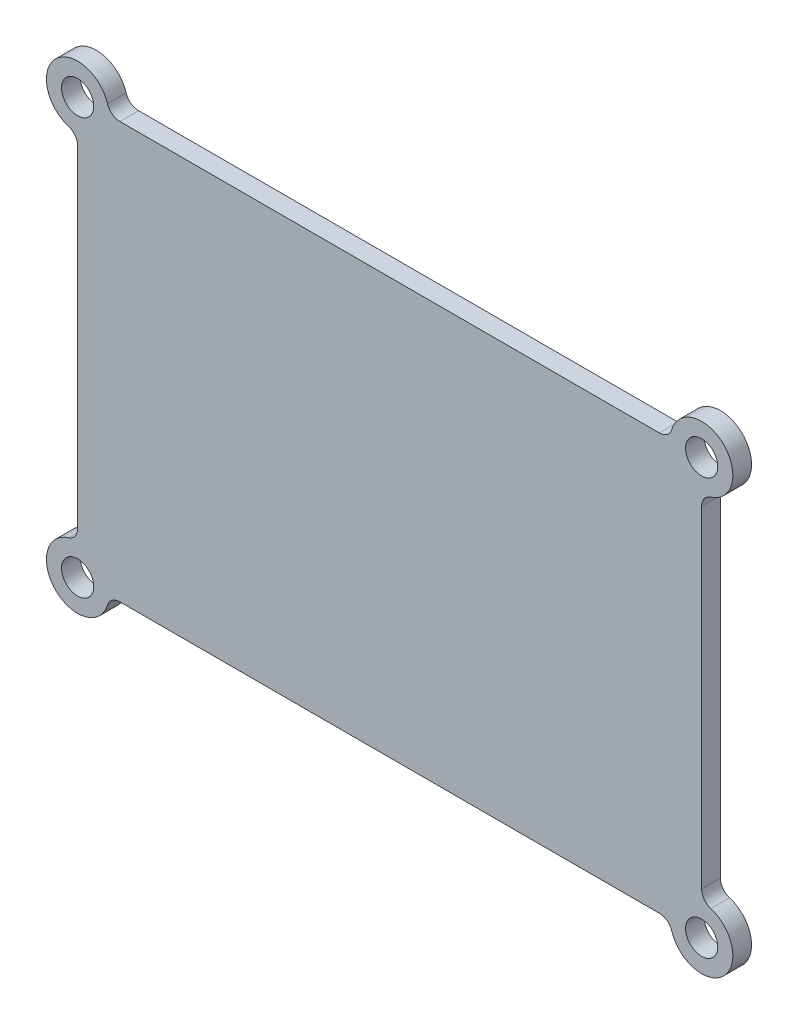
ISO-10303-21;
HEADER;
FILE_DESCRIPTION(('STEP AP214'),'2;1');
FILE_NAME('part.step','',(''),(''),'','','');
FILE_SCHEMA(('AUTOMOTIVE_DESIGN { 1 0 10303 214 1 1 1 1 }'));
ENDSEC;
DATA;
#1=APPLICATION_CONTEXT('core data for automotive mechanical design processes');
#2=APPLICATION_PROTOCOL_DEFINITION('international standard','automotive_design',2000,#1);
#3=PRODUCT_CONTEXT('',#1,'mechanical');
#4=PRODUCT('Part','Part','',(#3));
#5=PRODUCT_RELATED_PRODUCT_CATEGORY('part','',(#4));
#6=PRODUCT_DEFINITION_FORMATION('','',#4);
#7=PRODUCT_DEFINITION_CONTEXT('part definition',#1,'design');
#8=PRODUCT_DEFINITION('design','',#6,#7);
#9=PRODUCT_DEFINITION_SHAPE('','',#8);
#10=(LENGTH_UNIT() NAMED_UNIT(*) SI_UNIT(.MILLI.,.METRE.));
#11=(NAMED_UNIT(*) PLANE_ANGLE_UNIT() SI_UNIT($,.RADIAN.));
#12=(NAMED_UNIT(*) SI_UNIT($,.STERADIAN.) SOLID_ANGLE_UNIT());
#13=UNCERTAINTY_MEASURE_WITH_UNIT(LENGTH_MEASURE(1.E-05),#10,'distance_accuracy_value','');
#14=(GEOMETRIC_REPRESENTATION_CONTEXT(3) GLOBAL_UNCERTAINTY_ASSIGNED_CONTEXT((#13)) GLOBAL_UNIT_ASSIGNED_CONTEXT((#10,
#11,#12)) REPRESENTATION_CONTEXT('',''));
#15=CARTESIAN_POINT('',(0.,0.,0.));
#16=DIRECTION('',(0.,0.,1.));
#17=DIRECTION('',(1.,0.,0.));
#18=AXIS2_PLACEMENT_3D('',#15,#16,#17);
#19=CARTESIAN_POINT('',(-1.25,35.937980797682,1.8));
#20=DIRECTION('',(0.,0.,-1.));
#21=DIRECTION('',(-1.,0.,0.));
#22=AXIS2_PLACEMENT_3D('',#19,#20,#21);
#23=CYLINDRICAL_SURFACE('',#22,1.25);
#24=CARTESIAN_POINT('',(-1.25,35.937980797682,0.));
#25=DIRECTION('',(0.,0.,1.));
#26=DIRECTION('',(1.,0.,0.));
#27=AXIS2_PLACEMENT_3D('',#24,#25,#26);
#28=CIRCLE('',#27,1.25);
#29=CARTESIAN_POINT('',(0.,35.937980797682,0.));
#30=VERTEX_POINT('',#29);
#31=CARTESIAN_POINT('',(-0.882352941176471,37.1326923277755,0.));
#32=VERTEX_POINT('',#31);
#33=EDGE_CURVE('E218',#30,#32,#28,.T.);
#34=ORIENTED_EDGE('',*,*,#33,.F.);
#35=DIRECTION('',(0.,0.,-1.));
#36=VECTOR('',#35,1.);
#37=CARTESIAN_POINT('',(0.,35.937980797682,1.8));
#38=LINE('',#37,#36);
#39=CARTESIAN_POINT('',(0.,35.937980797682,1.8));
#40=VERTEX_POINT('',#39);
#41=EDGE_CURVE('E12',#40,#30,#38,.T.);
#42=ORIENTED_EDGE('',*,*,#41,.F.);
#43=CARTESIAN_POINT('',(-1.25,35.937980797682,1.8));
#44=DIRECTION('',(0.,0.,1.));
#45=DIRECTION('',(1.,0.,0.));
#46=AXIS2_PLACEMENT_3D('',#43,#44,#45);
#47=CIRCLE('',#46,1.25);
#48=CARTESIAN_POINT('',(-0.882352941176471,37.1326923277755,1.8));
#49=VERTEX_POINT('',#48);
#50=EDGE_CURVE('E294',#40,#49,#47,.T.);
#51=ORIENTED_EDGE('',*,*,#50,.T.);
#52=DIRECTION('',(0.,0.,-1.));
#53=VECTOR('',#52,1.);
#54=CARTESIAN_POINT('',(-0.882352941176471,37.1326923277755,1.8));
#55=LINE('',#54,#53);
#56=EDGE_CURVE('E119',#49,#32,#55,.T.);
#57=ORIENTED_EDGE('',*,*,#56,.T.);
#58=EDGE_LOOP('',(#34,#42,#51,#57));
#59=FACE_BOUND('',#58,.T.);
#60=ADVANCED_FACE('F44',(#59),#23,.F.);
#61=CARTESIAN_POINT('',(0.,0.,1.8));
#62=DIRECTION('',(-1.,0.,0.));
#63=DIRECTION('',(0.,0.,1.));
#64=AXIS2_PLACEMENT_3D('',#61,#62,#63);
#65=PLANE('',#64);
#66=DIRECTION('',(0.,1.,0.));
#67=VECTOR('',#66,1.);
#68=CARTESIAN_POINT('',(0.,0.,0.));
#69=LINE('',#68,#67);
#70=CARTESIAN_POINT('',(0.,4.06201920231798,0.));
#71=VERTEX_POINT('',#70);
#72=EDGE_CURVE('E222',#71,#30,#69,.T.);
#73=ORIENTED_EDGE('',*,*,#72,.F.);
#74=DIRECTION('',(0.,0.,-1.));
#75=VECTOR('',#74,1.);
#76=CARTESIAN_POINT('',(0.,4.06201920231798,1.8));
#77=LINE('',#76,#75);
#78=CARTESIAN_POINT('',(0.,4.06201920231798,1.8));
#79=VERTEX_POINT('',#78);
#80=EDGE_CURVE('E53',#79,#71,#77,.T.);
#81=ORIENTED_EDGE('',*,*,#80,.F.);
#82=DIRECTION('',(0.,1.,0.));
#83=VECTOR('',#82,1.);
#84=CARTESIAN_POINT('',(0.,0.,1.8));
#85=LINE('',#84,#83);
#86=EDGE_CURVE('E358',#79,#40,#85,.T.);
#87=ORIENTED_EDGE('',*,*,#86,.T.);
#88=ORIENTED_EDGE('',*,*,#41,.T.);
#89=EDGE_LOOP('',(#73,#81,#87,#88));
#90=FACE_BOUND('',#89,.T.);
#91=ADVANCED_FACE('F341',(#90),#65,.T.);
#92=CARTESIAN_POINT('',(-1.25,4.06201920231798,1.8));
#93=DIRECTION('',(0.,0.,-1.));
#94=DIRECTION('',(-1.,0.,0.));
#95=AXIS2_PLACEMENT_3D('',#92,#93,#94);
#96=CYLINDRICAL_SURFACE('',#95,1.25);
#97=CARTESIAN_POINT('',(-1.25,4.06201920231798,0.));
#98=DIRECTION('',(0.,0.,1.));
#99=DIRECTION('',(1.,0.,0.));
#100=AXIS2_PLACEMENT_3D('',#97,#98,#99);
#101=CIRCLE('',#100,1.25);
#102=CARTESIAN_POINT('',(-0.882352941176471,2.86730767222446,0.));
#103=VERTEX_POINT('',#102);
#104=EDGE_CURVE('E226',#103,#71,#101,.T.);
#105=ORIENTED_EDGE('',*,*,#104,.F.);
#106=DIRECTION('',(0.,0.,-1.));
#107=VECTOR('',#106,1.);
#108=CARTESIAN_POINT('',(-0.882352941176471,2.86730767222446,1.8));
#109=LINE('',#108,#107);
#110=CARTESIAN_POINT('',(-0.882352941176471,2.86730767222446,1.8));
#111=VERTEX_POINT('',#110);
#112=EDGE_CURVE('E328',#111,#103,#109,.T.);
#113=ORIENTED_EDGE('',*,*,#112,.F.);
#114=CARTESIAN_POINT('',(-1.25,4.06201920231798,1.8));
#115=DIRECTION('',(0.,0.,1.));
#116=DIRECTION('',(1.,0.,0.));
#117=AXIS2_PLACEMENT_3D('',#114,#115,#116);
#118=CIRCLE('',#117,1.25);
#119=EDGE_CURVE('E337',#111,#79,#118,.T.);
#120=ORIENTED_EDGE('',*,*,#119,.T.);
#121=ORIENTED_EDGE('',*,*,#80,.T.);
#122=EDGE_LOOP('',(#105,#113,#120,#121));
#123=FACE_BOUND('',#122,.T.);
#124=ADVANCED_FACE('F335',(#123),#96,.F.);
#125=CARTESIAN_POINT('',(0.,0.,1.8));
#126=DIRECTION('',(0.,0.,-1.));
#127=DIRECTION('',(-1.,0.,0.));
#128=AXIS2_PLACEMENT_3D('',#125,#126,#127);
#129=CYLINDRICAL_SURFACE('',#128,3.);
#130=CARTESIAN_POINT('',(0.,0.,0.));
#131=DIRECTION('',(0.,0.,1.));
#132=DIRECTION('',(1.,0.,0.));
#133=AXIS2_PLACEMENT_3D('',#130,#131,#132);
#134=CIRCLE('',#133,3.);
#135=CARTESIAN_POINT('',(2.86730767222446,-0.882352941176472,0.));
#136=VERTEX_POINT('',#135);
#137=EDGE_CURVE('E230',#103,#136,#134,.T.);
#138=ORIENTED_EDGE('',*,*,#137,.T.);
#139=DIRECTION('',(0.,0.,-1.));
#140=VECTOR('',#139,1.);
#141=CARTESIAN_POINT('',(2.86730767222446,-0.882352941176472,1.8));
#142=LINE('',#141,#140);
#143=CARTESIAN_POINT('',(2.86730767222446,-0.882352941176472,1.8));
#144=VERTEX_POINT('',#143);
#145=EDGE_CURVE('E325',#144,#136,#142,.T.);
#146=ORIENTED_EDGE('',*,*,#145,.F.);
#147=CARTESIAN_POINT('',(0.,0.,1.8));
#148=DIRECTION('',(0.,0.,1.));
#149=DIRECTION('',(1.,0.,0.));
#150=AXIS2_PLACEMENT_3D('',#147,#148,#149);
#151=CIRCLE('',#150,3.);
#152=EDGE_CURVE('E353',#111,#144,#151,.T.);
#153=ORIENTED_EDGE('',*,*,#152,.F.);
#154=ORIENTED_EDGE('',*,*,#112,.T.);
#155=EDGE_LOOP('',(#138,#146,#153,#154));
#156=FACE_BOUND('',#155,.T.);
#157=ADVANCED_FACE('F350',(#156),#129,.T.);
#158=CARTESIAN_POINT('',(4.06201920231798,-1.25,1.8));
#159=DIRECTION('',(0.,0.,-1.));
#160=DIRECTION('',(-1.,0.,0.));
#161=AXIS2_PLACEMENT_3D('',#158,#159,#160);
#162=CYLINDRICAL_SURFACE('',#161,1.25);
#163=CARTESIAN_POINT('',(4.06201920231798,-1.25,0.));
#164=DIRECTION('',(0.,0.,1.));
#165=DIRECTION('',(1.,0.,0.));
#166=AXIS2_PLACEMENT_3D('',#163,#164,#165);
#167=CIRCLE('',#166,1.25);
#168=CARTESIAN_POINT('',(4.06201920231798,0.,0.));
#169=VERTEX_POINT('',#168);
#170=EDGE_CURVE('E234',#169,#136,#167,.T.);
#171=ORIENTED_EDGE('',*,*,#170,.F.);
#172=DIRECTION('',(0.,0.,-1.));
#173=VECTOR('',#172,1.);
#174=CARTESIAN_POINT('',(4.06201920231798,0.,1.8));
#175=LINE('',#174,#173);
#176=CARTESIAN_POINT('',(4.06201920231798,0.,1.8));
#177=VERTEX_POINT('',#176);
#178=EDGE_CURVE('E322',#177,#169,#175,.T.);
#179=ORIENTED_EDGE('',*,*,#178,.F.);
#180=CARTESIAN_POINT('',(4.06201920231798,-1.25,1.8));
#181=DIRECTION('',(0.,0.,1.));
#182=DIRECTION('',(1.,0.,0.));
#183=AXIS2_PLACEMENT_3D('',#180,#181,#182);
#184=CIRCLE('',#183,1.25);
#185=EDGE_CURVE('E356',#177,#144,#184,.T.);
#186=ORIENTED_EDGE('',*,*,#185,.T.);
#187=ORIENTED_EDGE('',*,*,#145,.T.);
#188=EDGE_LOOP('',(#171,#179,#186,#187));
#189=FACE_BOUND('',#188,.T.);
#190=ADVANCED_FACE('F437',(#189),#162,.F.);
#191=CARTESIAN_POINT('',(0.,0.,1.8));
#192=DIRECTION('',(0.,1.,0.));
#193=DIRECTION('',(-1.,0.,0.));
#194=AXIS2_PLACEMENT_3D('',#191,#192,#193);
#195=PLANE('',#194);
#196=DIRECTION('',(1.,0.,0.));
#197=VECTOR('',#196,1.);
#198=CARTESIAN_POINT('',(0.,0.,0.));
#199=LINE('',#198,#197);
#200=CARTESIAN_POINT('',(55.937980797682,0.,0.));
#201=VERTEX_POINT('',#200);
#202=EDGE_CURVE('E238',#169,#201,#199,.T.);
#203=ORIENTED_EDGE('',*,*,#202,.T.);
#204=DIRECTION('',(0.,0.,-1.));
#205=VECTOR('',#204,1.);
#206=CARTESIAN_POINT('',(55.937980797682,0.,1.8));
#207=LINE('',#206,#205);
#208=CARTESIAN_POINT('',(55.937980797682,0.,1.8));
#209=VERTEX_POINT('',#208);
#210=EDGE_CURVE('E319',#209,#201,#207,.T.);
#211=ORIENTED_EDGE('',*,*,#210,.F.);
#212=DIRECTION('',(1.,0.,0.));
#213=VECTOR('',#212,1.);
#214=CARTESIAN_POINT('',(0.,0.,1.8));
#215=LINE('',#214,#213);
#216=EDGE_CURVE('E378',#177,#209,#215,.T.);
#217=ORIENTED_EDGE('',*,*,#216,.F.);
#218=ORIENTED_EDGE('',*,*,#178,.T.);
#219=EDGE_LOOP('',(#203,#211,#217,#218));
#220=FACE_BOUND('',#219,.T.);
#221=ADVANCED_FACE('F440',(#220),#195,.F.);
#222=CARTESIAN_POINT('',(55.937980797682,-1.25,1.8));
#223=DIRECTION('',(0.,0.,-1.));
#224=DIRECTION('',(-1.,0.,0.));
#225=AXIS2_PLACEMENT_3D('',#222,#223,#224);
#226=CYLINDRICAL_SURFACE('',#225,1.25);
#227=CARTESIAN_POINT('',(55.937980797682,-1.25,0.));
#228=DIRECTION('',(0.,0.,1.));
#229=DIRECTION('',(1.,0.,0.));
#230=AXIS2_PLACEMENT_3D('',#227,#228,#229);
#231=CIRCLE('',#230,1.25);
#232=CARTESIAN_POINT('',(57.1326923277755,-0.882352941176468,0.));
#233=VERTEX_POINT('',#232);
#234=EDGE_CURVE('E242',#233,#201,#231,.T.);
#235=ORIENTED_EDGE('',*,*,#234,.F.);
#236=DIRECTION('',(0.,0.,-1.));
#237=VECTOR('',#236,1.);
#238=CARTESIAN_POINT('',(57.1326923277755,-0.882352941176468,1.8));
#239=LINE('',#238,#237);
#240=CARTESIAN_POINT('',(57.1326923277755,-0.882352941176468,1.8));
#241=VERTEX_POINT('',#240);
#242=EDGE_CURVE('E316',#241,#233,#239,.T.);
#243=ORIENTED_EDGE('',*,*,#242,.F.);
#244=CARTESIAN_POINT('',(55.937980797682,-1.25,1.8));
#245=DIRECTION('',(0.,0.,1.));
#246=DIRECTION('',(1.,0.,0.));
#247=AXIS2_PLACEMENT_3D('',#244,#245,#246);
#248=CIRCLE('',#247,1.25);
#249=EDGE_CURVE('E382',#241,#209,#248,.T.);
#250=ORIENTED_EDGE('',*,*,#249,.T.);
#251=ORIENTED_EDGE('',*,*,#210,.T.);
#252=EDGE_LOOP('',(#235,#243,#250,#251));
#253=FACE_BOUND('',#252,.T.);
#254=ADVANCED_FACE('F444',(#253),#226,.F.);
#255=CARTESIAN_POINT('',(60.,0.,1.8));
#256=DIRECTION('',(0.,0.,-1.));
#257=DIRECTION('',(-1.,0.,0.));
#258=AXIS2_PLACEMENT_3D('',#255,#256,#257);
#259=CYLINDRICAL_SURFACE('',#258,3.00000000000001);
#260=CARTESIAN_POINT('',(60.,0.,0.));
#261=DIRECTION('',(0.,0.,1.));
#262=DIRECTION('',(1.,0.,0.));
#263=AXIS2_PLACEMENT_3D('',#260,#261,#262);
#264=CIRCLE('',#263,3.00000000000001);
#265=CARTESIAN_POINT('',(60.8823529411765,2.86730767222446,0.));
#266=VERTEX_POINT('',#265);
#267=EDGE_CURVE('E246',#233,#266,#264,.T.);
#268=ORIENTED_EDGE('',*,*,#267,.T.);
#269=DIRECTION('',(0.,0.,-1.));
#270=VECTOR('',#269,1.);
#271=CARTESIAN_POINT('',(60.8823529411765,2.86730767222446,1.8));
#272=LINE('',#271,#270);
#273=CARTESIAN_POINT('',(60.8823529411765,2.86730767222446,1.8));
#274=VERTEX_POINT('',#273);
#275=EDGE_CURVE('E313',#274,#266,#272,.T.);
#276=ORIENTED_EDGE('',*,*,#275,.F.);
#277=CARTESIAN_POINT('',(60.,0.,1.8));
#278=DIRECTION('',(0.,0.,1.));
#279=DIRECTION('',(1.,0.,0.));
#280=AXIS2_PLACEMENT_3D('',#277,#278,#279);
#281=CIRCLE('',#280,3.00000000000001);
#282=EDGE_CURVE('E387',#241,#274,#281,.T.);
#283=ORIENTED_EDGE('',*,*,#282,.F.);
#284=ORIENTED_EDGE('',*,*,#242,.T.);
#285=EDGE_LOOP('',(#268,#276,#283,#284));
#286=FACE_BOUND('',#285,.T.);
#287=ADVANCED_FACE('F448',(#286),#259,.T.);
#288=CARTESIAN_POINT('',(61.25,4.06201920231798,1.8));
#289=DIRECTION('',(0.,0.,-1.));
#290=DIRECTION('',(-1.,0.,0.));
#291=AXIS2_PLACEMENT_3D('',#288,#289,#290);
#292=CYLINDRICAL_SURFACE('',#291,1.25);
#293=CARTESIAN_POINT('',(61.25,4.06201920231798,0.));
#294=DIRECTION('',(0.,0.,1.));
#295=DIRECTION('',(1.,0.,0.));
#296=AXIS2_PLACEMENT_3D('',#293,#294,#295);
#297=CIRCLE('',#296,1.25);
#298=CARTESIAN_POINT('',(60.,4.06201920231798,0.));
#299=VERTEX_POINT('',#298);
#300=EDGE_CURVE('E250',#299,#266,#297,.T.);
#301=ORIENTED_EDGE('',*,*,#300,.F.);
#302=DIRECTION('',(0.,0.,-1.));
#303=VECTOR('',#302,1.);
#304=CARTESIAN_POINT('',(60.,4.06201920231798,1.8));
#305=LINE('',#304,#303);
#306=CARTESIAN_POINT('',(60.,4.06201920231798,1.8));
#307=VERTEX_POINT('',#306);
#308=EDGE_CURVE('E310',#307,#299,#305,.T.);
#309=ORIENTED_EDGE('',*,*,#308,.F.);
#310=CARTESIAN_POINT('',(61.25,4.06201920231798,1.8));
#311=DIRECTION('',(0.,0.,1.));
#312=DIRECTION('',(1.,0.,0.));
#313=AXIS2_PLACEMENT_3D('',#310,#311,#312);
#314=CIRCLE('',#313,1.25);
#315=EDGE_CURVE('E395',#307,#274,#314,.T.);
#316=ORIENTED_EDGE('',*,*,#315,.T.);
#317=ORIENTED_EDGE('',*,*,#275,.T.);
#318=EDGE_LOOP('',(#301,#309,#316,#317));
#319=FACE_BOUND('',#318,.T.);
#320=ADVANCED_FACE('F452',(#319),#292,.F.);
#321=CARTESIAN_POINT('',(60.,0.,1.8));
#322=DIRECTION('',(-1.,0.,0.));
#323=DIRECTION('',(0.,0.,1.));
#324=AXIS2_PLACEMENT_3D('',#321,#322,#323);
#325=PLANE('',#324);
#326=DIRECTION('',(0.,1.,0.));
#327=VECTOR('',#326,1.);
#328=CARTESIAN_POINT('',(60.,0.,0.));
#329=LINE('',#328,#327);
#330=CARTESIAN_POINT('',(60.,35.937980797682,0.));
#331=VERTEX_POINT('',#330);
#332=EDGE_CURVE('E254',#299,#331,#329,.T.);
#333=ORIENTED_EDGE('',*,*,#332,.T.);
#334=DIRECTION('',(0.,0.,-1.));
#335=VECTOR('',#334,1.);
#336=CARTESIAN_POINT('',(60.,35.937980797682,1.8));
#337=LINE('',#336,#335);
#338=CARTESIAN_POINT('',(60.,35.937980797682,1.8));
#339=VERTEX_POINT('',#338);
#340=EDGE_CURVE('E307',#339,#331,#337,.T.);
#341=ORIENTED_EDGE('',*,*,#340,.F.);
#342=DIRECTION('',(0.,1.,0.));
#343=VECTOR('',#342,1.);
#344=CARTESIAN_POINT('',(60.,0.,1.8));
#345=LINE('',#344,#343);
#346=EDGE_CURVE('E399',#307,#339,#345,.T.);
#347=ORIENTED_EDGE('',*,*,#346,.F.);
#348=ORIENTED_EDGE('',*,*,#308,.T.);
#349=EDGE_LOOP('',(#333,#341,#347,#348));
#350=FACE_BOUND('',#349,.T.);
#351=ADVANCED_FACE('F456',(#350),#325,.F.);
#352=CARTESIAN_POINT('',(61.25,35.937980797682,1.8));
#353=DIRECTION('',(0.,0.,-1.));
#354=DIRECTION('',(-1.,0.,0.));
#355=AXIS2_PLACEMENT_3D('',#352,#353,#354);
#356=CYLINDRICAL_SURFACE('',#355,1.25);
#357=CARTESIAN_POINT('',(61.25,35.937980797682,0.));
#358=DIRECTION('',(0.,0.,1.));
#359=DIRECTION('',(1.,0.,0.));
#360=AXIS2_PLACEMENT_3D('',#357,#358,#359);
#361=CIRCLE('',#360,1.25);
#362=CARTESIAN_POINT('',(60.8823529411765,37.1326923277755,0.));
#363=VERTEX_POINT('',#362);
#364=EDGE_CURVE('E258',#363,#331,#361,.T.);
#365=ORIENTED_EDGE('',*,*,#364,.F.);
#366=DIRECTION('',(0.,0.,-1.));
#367=VECTOR('',#366,1.);
#368=CARTESIAN_POINT('',(60.8823529411765,37.1326923277755,1.8));
#369=LINE('',#368,#367);
#370=CARTESIAN_POINT('',(60.8823529411765,37.1326923277755,1.8));
#371=VERTEX_POINT('',#370);
#372=EDGE_CURVE('E304',#371,#363,#369,.T.);
#373=ORIENTED_EDGE('',*,*,#372,.F.);
#374=CARTESIAN_POINT('',(61.25,35.937980797682,1.8));
#375=DIRECTION('',(0.,0.,1.));
#376=DIRECTION('',(1.,0.,0.));
#377=AXIS2_PLACEMENT_3D('',#374,#375,#376);
#378=CIRCLE('',#377,1.25);
#379=EDGE_CURVE('E403',#371,#339,#378,.T.);
#380=ORIENTED_EDGE('',*,*,#379,.T.);
#381=ORIENTED_EDGE('',*,*,#340,.T.);
#382=EDGE_LOOP('',(#365,#373,#380,#381));
#383=FACE_BOUND('',#382,.T.);
#384=ADVANCED_FACE('F460',(#383),#356,.F.);
#385=CARTESIAN_POINT('',(60.,40.,1.8));
#386=DIRECTION('',(0.,0.,-1.));
#387=DIRECTION('',(-1.,0.,0.));
#388=AXIS2_PLACEMENT_3D('',#385,#386,#387);
#389=CYLINDRICAL_SURFACE('',#388,3.00000000000001);
#390=CARTESIAN_POINT('',(60.,40.,0.));
#391=DIRECTION('',(0.,0.,1.));
#392=DIRECTION('',(1.,0.,0.));
#393=AXIS2_PLACEMENT_3D('',#390,#391,#392);
#394=CIRCLE('',#393,3.00000000000001);
#395=CARTESIAN_POINT('',(57.1326923277755,40.8823529411765,0.));
#396=VERTEX_POINT('',#395);
#397=EDGE_CURVE('E262',#363,#396,#394,.T.);
#398=ORIENTED_EDGE('',*,*,#397,.T.);
#399=DIRECTION('',(0.,0.,-1.));
#400=VECTOR('',#399,1.);
#401=CARTESIAN_POINT('',(57.1326923277755,40.8823529411765,1.8));
#402=LINE('',#401,#400);
#403=CARTESIAN_POINT('',(57.1326923277755,40.8823529411765,1.8));
#404=VERTEX_POINT('',#403);
#405=EDGE_CURVE('E301',#404,#396,#402,.T.);
#406=ORIENTED_EDGE('',*,*,#405,.F.);
#407=CARTESIAN_POINT('',(60.,40.,1.8));
#408=DIRECTION('',(0.,0.,1.));
#409=DIRECTION('',(1.,0.,0.));
#410=AXIS2_PLACEMENT_3D('',#407,#408,#409);
#411=CIRCLE('',#410,3.00000000000001);
#412=EDGE_CURVE('E408',#371,#404,#411,.T.);
#413=ORIENTED_EDGE('',*,*,#412,.F.);
#414=ORIENTED_EDGE('',*,*,#372,.T.);
#415=EDGE_LOOP('',(#398,#406,#413,#414));
#416=FACE_BOUND('',#415,.T.);
#417=ADVANCED_FACE('F419',(#416),#389,.T.);
#418=CARTESIAN_POINT('',(55.937980797682,41.25,1.8));
#419=DIRECTION('',(0.,0.,-1.));
#420=DIRECTION('',(-1.,0.,0.));
#421=AXIS2_PLACEMENT_3D('',#418,#419,#420);
#422=CYLINDRICAL_SURFACE('',#421,1.25);
#423=CARTESIAN_POINT('',(55.937980797682,41.25,0.));
#424=DIRECTION('',(0.,0.,1.));
#425=DIRECTION('',(1.,0.,0.));
#426=AXIS2_PLACEMENT_3D('',#423,#424,#425);
#427=CIRCLE('',#426,1.25);
#428=CARTESIAN_POINT('',(55.937980797682,40.,0.));
#429=VERTEX_POINT('',#428);
#430=EDGE_CURVE('E266',#429,#396,#427,.T.);
#431=ORIENTED_EDGE('',*,*,#430,.F.);
#432=DIRECTION('',(0.,0.,-1.));
#433=VECTOR('',#432,1.);
#434=CARTESIAN_POINT('',(55.937980797682,40.,1.8));
#435=LINE('',#434,#433);
#436=CARTESIAN_POINT('',(55.937980797682,40.,1.8));
#437=VERTEX_POINT('',#436);
#438=EDGE_CURVE('E173',#437,#429,#435,.T.);
#439=ORIENTED_EDGE('',*,*,#438,.F.);
#440=CARTESIAN_POINT('',(55.937980797682,41.25,1.8));
#441=DIRECTION('',(0.,0.,1.));
#442=DIRECTION('',(1.,0.,0.));
#443=AXIS2_PLACEMENT_3D('',#440,#441,#442);
#444=CIRCLE('',#443,1.25);
#445=EDGE_CURVE('E180',#437,#404,#444,.T.);
#446=ORIENTED_EDGE('',*,*,#445,.T.);
#447=ORIENTED_EDGE('',*,*,#405,.T.);
#448=EDGE_LOOP('',(#431,#439,#446,#447));
#449=FACE_BOUND('',#448,.T.);
#450=ADVANCED_FACE('F422',(#449),#422,.F.);
#451=CARTESIAN_POINT('',(0.,40.,1.8));
#452=DIRECTION('',(0.,1.,0.));
#453=DIRECTION('',(0.,0.,1.));
#454=AXIS2_PLACEMENT_3D('',#451,#452,#453);
#455=PLANE('',#454);
#456=DIRECTION('',(1.,0.,0.));
#457=VECTOR('',#456,1.);
#458=CARTESIAN_POINT('',(0.,40.,0.));
#459=LINE('',#458,#457);
#460=CARTESIAN_POINT('',(4.06201920231798,40.,0.));
#461=VERTEX_POINT('',#460);
#462=EDGE_CURVE('E167',#461,#429,#459,.T.);
#463=ORIENTED_EDGE('',*,*,#462,.F.);
#464=DIRECTION('',(0.,0.,-1.));
#465=VECTOR('',#464,1.);
#466=CARTESIAN_POINT('',(4.06201920231798,40.,1.8));
#467=LINE('',#466,#465);
#468=CARTESIAN_POINT('',(4.06201920231798,40.,1.8));
#469=VERTEX_POINT('',#468);
#470=EDGE_CURVE('E162',#469,#461,#467,.T.);
#471=ORIENTED_EDGE('',*,*,#470,.F.);
#472=DIRECTION('',(1.,0.,0.));
#473=VECTOR('',#472,1.);
#474=CARTESIAN_POINT('',(0.,40.,1.8));
#475=LINE('',#474,#473);
#476=EDGE_CURVE('E165',#469,#437,#475,.T.);
#477=ORIENTED_EDGE('',*,*,#476,.T.);
#478=ORIENTED_EDGE('',*,*,#438,.T.);
#479=EDGE_LOOP('',(#463,#471,#477,#478));
#480=FACE_BOUND('',#479,.T.);
#481=ADVANCED_FACE('F164',(#480),#455,.T.);
#482=CARTESIAN_POINT('',(4.06201920231798,41.25,1.8));
#483=DIRECTION('',(0.,0.,-1.));
#484=DIRECTION('',(-1.,0.,0.));
#485=AXIS2_PLACEMENT_3D('',#482,#483,#484);
#486=CYLINDRICAL_SURFACE('',#485,1.25);
#487=CARTESIAN_POINT('',(4.06201920231798,41.25,0.));
#488=DIRECTION('',(0.,0.,1.));
#489=DIRECTION('',(1.,0.,0.));
#490=AXIS2_PLACEMENT_3D('',#487,#488,#489);
#491=CIRCLE('',#490,1.25);
#492=CARTESIAN_POINT('',(2.86730767222446,40.8823529411765,0.));
#493=VERTEX_POINT('',#492);
#494=EDGE_CURVE('E272',#493,#461,#491,.T.);
#495=ORIENTED_EDGE('',*,*,#494,.F.);
#496=DIRECTION('',(0.,0.,-1.));
#497=VECTOR('',#496,1.);
#498=CARTESIAN_POINT('',(2.86730767222446,40.8823529411765,1.8));
#499=LINE('',#498,#497);
#500=CARTESIAN_POINT('',(2.86730767222446,40.8823529411765,1.8));
#501=VERTEX_POINT('',#500);
#502=EDGE_CURVE('E112',#501,#493,#499,.T.);
#503=ORIENTED_EDGE('',*,*,#502,.F.);
#504=CARTESIAN_POINT('',(4.06201920231798,41.25,1.8));
#505=DIRECTION('',(0.,0.,1.));
#506=DIRECTION('',(1.,0.,0.));
#507=AXIS2_PLACEMENT_3D('',#504,#505,#506);
#508=CIRCLE('',#507,1.25);
#509=EDGE_CURVE('E178',#501,#469,#508,.T.);
#510=ORIENTED_EDGE('',*,*,#509,.T.);
#511=ORIENTED_EDGE('',*,*,#470,.T.);
#512=EDGE_LOOP('',(#495,#503,#510,#511));
#513=FACE_BOUND('',#512,.T.);
#514=ADVANCED_FACE('F183',(#513),#486,.F.);
#515=CARTESIAN_POINT('',(60.,40.,1.8));
#516=DIRECTION('',(0.,0.,-1.));
#517=DIRECTION('',(-1.,0.,0.));
#518=AXIS2_PLACEMENT_3D('',#515,#516,#517);
#519=CYLINDRICAL_SURFACE('',#518,1.55);
#520=CARTESIAN_POINT('',(60.,40.,1.8));
#521=DIRECTION('',(0.,0.,1.));
#522=DIRECTION('',(1.,0.,0.));
#523=AXIS2_PLACEMENT_3D('',#520,#521,#522);
#524=CIRCLE('',#523,1.55);
#525=CARTESIAN_POINT('',(61.55,40.,1.8));
#526=VERTEX_POINT('',#525);
#527=EDGE_CURVE('E209',#526,#526,#524,.T.);
#528=ORIENTED_EDGE('',*,*,#527,.T.);
#529=EDGE_LOOP('',(#528));
#530=FACE_BOUND('',#529,.T.);
#531=CARTESIAN_POINT('',(60.,40.,0.));
#532=DIRECTION('',(0.,0.,1.));
#533=DIRECTION('',(1.,0.,0.));
#534=AXIS2_PLACEMENT_3D('',#531,#532,#533);
#535=CIRCLE('',#534,1.55);
#536=CARTESIAN_POINT('',(61.55,40.,0.));
#537=VERTEX_POINT('',#536);
#538=EDGE_CURVE('E286',#537,#537,#535,.T.);
#539=ORIENTED_EDGE('',*,*,#538,.F.);
#540=EDGE_LOOP('',(#539));
#541=FACE_BOUND('',#540,.T.);
#542=ADVANCED_FACE('F473',(#530,#541),#519,.F.);
#543=CARTESIAN_POINT('',(60.,0.,1.8));
#544=DIRECTION('',(0.,0.,-1.));
#545=DIRECTION('',(-1.,0.,0.));
#546=AXIS2_PLACEMENT_3D('',#543,#544,#545);
#547=CYLINDRICAL_SURFACE('',#546,1.55);
#548=CARTESIAN_POINT('',(60.,0.,1.8));
#549=DIRECTION('',(0.,0.,1.));
#550=DIRECTION('',(1.,0.,0.));
#551=AXIS2_PLACEMENT_3D('',#548,#549,#550);
#552=CIRCLE('',#551,1.55);
#553=CARTESIAN_POINT('',(61.55,0.,1.8));
#554=VERTEX_POINT('',#553);
#555=EDGE_CURVE('E204',#554,#554,#552,.T.);
#556=ORIENTED_EDGE('',*,*,#555,.T.);
#557=EDGE_LOOP('',(#556));
#558=FACE_BOUND('',#557,.T.);
#559=CARTESIAN_POINT('',(60.,0.,0.));
#560=DIRECTION('',(0.,0.,1.));
#561=DIRECTION('',(1.,0.,0.));
#562=AXIS2_PLACEMENT_3D('',#559,#560,#561);
#563=CIRCLE('',#562,1.55);
#564=CARTESIAN_POINT('',(61.55,0.,0.));
#565=VERTEX_POINT('',#564);
#566=EDGE_CURVE('E282',#565,#565,#563,.T.);
#567=ORIENTED_EDGE('',*,*,#566,.F.);
#568=EDGE_LOOP('',(#567));
#569=FACE_BOUND('',#568,.T.);
#570=ADVANCED_FACE('F480',(#558,#569),#547,.F.);
#571=CARTESIAN_POINT('',(0.,0.,1.8));
#572=DIRECTION('',(0.,0.,-1.));
#573=DIRECTION('',(-1.,0.,0.));
#574=AXIS2_PLACEMENT_3D('',#571,#572,#573);
#575=CYLINDRICAL_SURFACE('',#574,1.55);
#576=CARTESIAN_POINT('',(0.,0.,1.8));
#577=DIRECTION('',(0.,0.,1.));
#578=DIRECTION('',(1.,0.,0.));
#579=AXIS2_PLACEMENT_3D('',#576,#577,#578);
#580=CIRCLE('',#579,1.55);
#581=CARTESIAN_POINT('',(1.55,0.,1.8));
#582=VERTEX_POINT('',#581);
#583=EDGE_CURVE('E187',#582,#582,#580,.T.);
#584=ORIENTED_EDGE('',*,*,#583,.T.);
#585=EDGE_LOOP('',(#584));
#586=FACE_BOUND('',#585,.T.);
#587=CARTESIAN_POINT('',(0.,0.,0.));
#588=DIRECTION('',(0.,0.,1.));
#589=DIRECTION('',(1.,0.,0.));
#590=AXIS2_PLACEMENT_3D('',#587,#588,#589);
#591=CIRCLE('',#590,1.55);
#592=CARTESIAN_POINT('',(1.55,0.,0.));
#593=VERTEX_POINT('',#592);
#594=EDGE_CURVE('E278',#593,#593,#591,.T.);
#595=ORIENTED_EDGE('',*,*,#594,.F.);
#596=EDGE_LOOP('',(#595));
#597=FACE_BOUND('',#596,.T.);
#598=ADVANCED_FACE('F477',(#586,#597),#575,.F.);
#599=CARTESIAN_POINT('',(0.,40.,1.8));
#600=DIRECTION('',(0.,0.,-1.));
#601=DIRECTION('',(-1.,0.,0.));
#602=AXIS2_PLACEMENT_3D('',#599,#600,#601);
#603=CYLINDRICAL_SURFACE('',#602,3.);
#604=CARTESIAN_POINT('',(0.,40.,0.));
#605=DIRECTION('',(0.,0.,1.));
#606=DIRECTION('',(1.,0.,0.));
#607=AXIS2_PLACEMENT_3D('',#604,#605,#606);
#608=CIRCLE('',#607,3.);
#609=EDGE_CURVE('E275',#493,#32,#608,.T.);
#610=ORIENTED_EDGE('',*,*,#609,.T.);
#611=ORIENTED_EDGE('',*,*,#56,.F.);
#612=CARTESIAN_POINT('',(0.,40.,1.8));
#613=DIRECTION('',(0.,0.,1.));
#614=DIRECTION('',(1.,0.,0.));
#615=AXIS2_PLACEMENT_3D('',#612,#613,#614);
#616=CIRCLE('',#615,3.);
#617=EDGE_CURVE('E61',#501,#49,#616,.T.);
#618=ORIENTED_EDGE('',*,*,#617,.F.);
#619=ORIENTED_EDGE('',*,*,#502,.T.);
#620=EDGE_LOOP('',(#610,#611,#618,#619));
#621=FACE_BOUND('',#620,.T.);
#622=ADVANCED_FACE('F423',(#621),#603,.T.);
#623=CARTESIAN_POINT('',(0.,40.,1.8));
#624=DIRECTION('',(0.,0.,-1.));
#625=DIRECTION('',(-1.,0.,0.));
#626=AXIS2_PLACEMENT_3D('',#623,#624,#625);
#627=CYLINDRICAL_SURFACE('',#626,1.55);
#628=CARTESIAN_POINT('',(0.,40.,1.8));
#629=DIRECTION('',(0.,0.,1.));
#630=DIRECTION('',(1.,0.,0.));
#631=AXIS2_PLACEMENT_3D('',#628,#629,#630);
#632=CIRCLE('',#631,1.55);
#633=CARTESIAN_POINT('',(1.55,40.,1.8));
#634=VERTEX_POINT('',#633);
#635=EDGE_CURVE('E213',#634,#634,#632,.T.);
#636=ORIENTED_EDGE('',*,*,#635,.T.);
#637=EDGE_LOOP('',(#636));
#638=FACE_BOUND('',#637,.T.);
#639=CARTESIAN_POINT('',(0.,40.,0.));
#640=DIRECTION('',(0.,0.,1.));
#641=DIRECTION('',(1.,0.,0.));
#642=AXIS2_PLACEMENT_3D('',#639,#640,#641);
#643=CIRCLE('',#642,1.55);
#644=CARTESIAN_POINT('',(1.55,40.,0.));
#645=VERTEX_POINT('',#644);
#646=EDGE_CURVE('E290',#645,#645,#643,.T.);
#647=ORIENTED_EDGE('',*,*,#646,.F.);
#648=EDGE_LOOP('',(#647));
#649=FACE_BOUND('',#648,.T.);
#650=ADVANCED_FACE('F476',(#638,#649),#627,.F.);
#651=CARTESIAN_POINT('',(0.,0.,1.8));
#652=DIRECTION('',(0.,0.,1.));
#653=DIRECTION('',(1.,0.,0.));
#654=AXIS2_PLACEMENT_3D('',#651,#652,#653);
#655=PLANE('',#654);
#656=ORIENTED_EDGE('',*,*,#50,.F.);
#657=ORIENTED_EDGE('',*,*,#86,.F.);
#658=ORIENTED_EDGE('',*,*,#119,.F.);
#659=ORIENTED_EDGE('',*,*,#152,.T.);
#660=ORIENTED_EDGE('',*,*,#185,.F.);
#661=ORIENTED_EDGE('',*,*,#216,.T.);
#662=ORIENTED_EDGE('',*,*,#249,.F.);
#663=ORIENTED_EDGE('',*,*,#282,.T.);
#664=ORIENTED_EDGE('',*,*,#315,.F.);
#665=ORIENTED_EDGE('',*,*,#346,.T.);
#666=ORIENTED_EDGE('',*,*,#379,.F.);
#667=ORIENTED_EDGE('',*,*,#412,.T.);
#668=ORIENTED_EDGE('',*,*,#445,.F.);
#669=ORIENTED_EDGE('',*,*,#476,.F.);
#670=ORIENTED_EDGE('',*,*,#509,.F.);
#671=ORIENTED_EDGE('',*,*,#617,.T.);
#672=EDGE_LOOP('',(#656,#657,#658,#659,#660,#661,#662,#663,#664,#665,#666,#667,#668,#669,#670,#671));
#673=FACE_BOUND('',#672,.T.);
#674=ORIENTED_EDGE('',*,*,#583,.F.);
#675=EDGE_LOOP('',(#674));
#676=FACE_BOUND('',#675,.T.);
#677=ORIENTED_EDGE('',*,*,#555,.F.);
#678=EDGE_LOOP('',(#677));
#679=FACE_BOUND('',#678,.T.);
#680=ORIENTED_EDGE('',*,*,#527,.F.);
#681=EDGE_LOOP('',(#680));
#682=FACE_BOUND('',#681,.T.);
#683=ORIENTED_EDGE('',*,*,#635,.F.);
#684=EDGE_LOOP('',(#683));
#685=FACE_BOUND('',#684,.T.);
#686=ADVANCED_FACE('F176',(#673,#676,#679,#682,#685),#655,.T.);
#687=CARTESIAN_POINT('',(0.,0.,0.));
#688=DIRECTION('',(0.,0.,1.));
#689=DIRECTION('',(1.,0.,0.));
#690=AXIS2_PLACEMENT_3D('',#687,#688,#689);
#691=PLANE('',#690);
#692=ORIENTED_EDGE('',*,*,#33,.T.);
#693=ORIENTED_EDGE('',*,*,#609,.F.);
#694=ORIENTED_EDGE('',*,*,#494,.T.);
#695=ORIENTED_EDGE('',*,*,#462,.T.);
#696=ORIENTED_EDGE('',*,*,#430,.T.);
#697=ORIENTED_EDGE('',*,*,#397,.F.);
#698=ORIENTED_EDGE('',*,*,#364,.T.);
#699=ORIENTED_EDGE('',*,*,#332,.F.);
#700=ORIENTED_EDGE('',*,*,#300,.T.);
#701=ORIENTED_EDGE('',*,*,#267,.F.);
#702=ORIENTED_EDGE('',*,*,#234,.T.);
#703=ORIENTED_EDGE('',*,*,#202,.F.);
#704=ORIENTED_EDGE('',*,*,#170,.T.);
#705=ORIENTED_EDGE('',*,*,#137,.F.);
#706=ORIENTED_EDGE('',*,*,#104,.T.);
#707=ORIENTED_EDGE('',*,*,#72,.T.);
#708=EDGE_LOOP('',(#692,#693,#694,#695,#696,#697,#698,#699,#700,#701,#702,#703,#704,#705,#706,#707));
#709=FACE_BOUND('',#708,.T.);
#710=ORIENTED_EDGE('',*,*,#594,.T.);
#711=EDGE_LOOP('',(#710));
#712=FACE_BOUND('',#711,.T.);
#713=ORIENTED_EDGE('',*,*,#566,.T.);
#714=EDGE_LOOP('',(#713));
#715=FACE_BOUND('',#714,.T.);
#716=ORIENTED_EDGE('',*,*,#538,.T.);
#717=EDGE_LOOP('',(#716));
#718=FACE_BOUND('',#717,.T.);
#719=ORIENTED_EDGE('',*,*,#646,.T.);
#720=EDGE_LOOP('',(#719));
#721=FACE_BOUND('',#720,.T.);
#722=ADVANCED_FACE('F344',(#709,#712,#715,#718,#721),#691,.F.);
#723=CLOSED_SHELL('',(#60,#91,#124,#157,#190,#221,#254,#287,#320,#351,#384,#417,#450,#481,#514,
#542,#570,#598,#622,#650,#686,#722));
#724=MANIFOLD_SOLID_BREP('B2',#723);
#725=ADVANCED_BREP_SHAPE_REPRESENTATION('',(#18,#724),#14);
#726=SHAPE_DEFINITION_REPRESENTATION(#9,#725);
ENDSEC;
END-ISO-10303-21;
